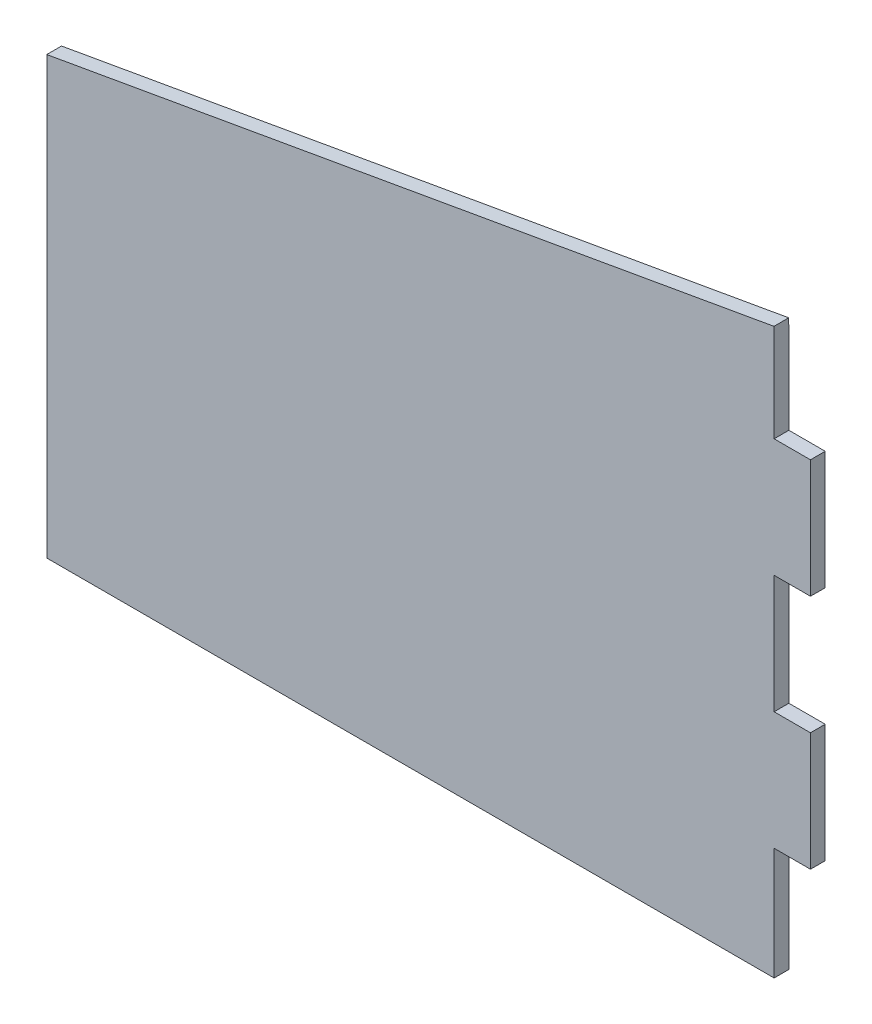
ISO-10303-21;
HEADER;
FILE_DESCRIPTION(('STEP AP214'),'2;1');
FILE_NAME('part.step','',(''),(''),'','','');
FILE_SCHEMA(('AUTOMOTIVE_DESIGN { 1 0 10303 214 1 1 1 1 }'));
ENDSEC;
DATA;
#1=APPLICATION_CONTEXT('core data for automotive mechanical design processes');
#2=APPLICATION_PROTOCOL_DEFINITION('international standard','automotive_design',2000,#1);
#3=PRODUCT_CONTEXT('',#1,'mechanical');
#4=PRODUCT('Part','Part','',(#3));
#5=PRODUCT_RELATED_PRODUCT_CATEGORY('part','',(#4));
#6=PRODUCT_DEFINITION_FORMATION('','',#4);
#7=PRODUCT_DEFINITION_CONTEXT('part definition',#1,'design');
#8=PRODUCT_DEFINITION('design','',#6,#7);
#9=PRODUCT_DEFINITION_SHAPE('','',#8);
#10=(LENGTH_UNIT() NAMED_UNIT(*) SI_UNIT(.MILLI.,.METRE.));
#11=(NAMED_UNIT(*) PLANE_ANGLE_UNIT() SI_UNIT($,.RADIAN.));
#12=(NAMED_UNIT(*) SI_UNIT($,.STERADIAN.) SOLID_ANGLE_UNIT());
#13=UNCERTAINTY_MEASURE_WITH_UNIT(LENGTH_MEASURE(1.E-05),#10,'distance_accuracy_value','');
#14=(GEOMETRIC_REPRESENTATION_CONTEXT(3) GLOBAL_UNCERTAINTY_ASSIGNED_CONTEXT((#13)) GLOBAL_UNIT_ASSIGNED_CONTEXT((#10,
#11,#12)) REPRESENTATION_CONTEXT('',''));
#15=CARTESIAN_POINT('',(0.,0.,0.));
#16=DIRECTION('',(0.,0.,1.));
#17=DIRECTION('',(1.,0.,0.));
#18=AXIS2_PLACEMENT_3D('',#15,#16,#17);
#19=CARTESIAN_POINT('',(0.,-91.4769385848753,196.208778379794));
#20=DIRECTION('',(0.999998823684038,0.00153382871905047,0.));
#21=DIRECTION('',(-0.00153382871905047,0.999998823684039,0.));
#22=AXIS2_PLACEMENT_3D('',#19,#20,#21);
#23=PLANE('',#22);
#24=DIRECTION('',(-0.00153382871905047,0.999998823684039,0.));
#25=VECTOR('',#24,1.);
#26=CARTESIAN_POINT('',(0.,-91.4769385848753,206.368778379794));
#27=LINE('',#26,#25);
#28=CARTESIAN_POINT('',(0.,-91.4769385848753,206.368778379794));
#29=VERTEX_POINT('',#28);
#30=CARTESIAN_POINT('',(-0.102720764161568,-24.5068512122227,206.368778379794));
#31=VERTEX_POINT('',#30);
#32=EDGE_CURVE('E160',#29,#31,#27,.T.);
#33=ORIENTED_EDGE('',*,*,#32,.F.);
#34=DIRECTION('',(0.,0.,1.));
#35=VECTOR('',#34,1.);
#36=CARTESIAN_POINT('',(0.,-91.4769385848753,196.208778379794));
#37=LINE('',#36,#35);
#38=CARTESIAN_POINT('',(0.,-91.4769385848753,196.208778379794));
#39=VERTEX_POINT('',#38);
#40=EDGE_CURVE('E11',#39,#29,#37,.T.);
#41=ORIENTED_EDGE('',*,*,#40,.F.);
#42=DIRECTION('',(-0.00153382871905047,0.999998823684039,0.));
#43=VECTOR('',#42,1.);
#44=CARTESIAN_POINT('',(0.,-91.4769385848753,196.208778379794));
#45=LINE('',#44,#43);
#46=CARTESIAN_POINT('',(-0.102720764161568,-24.5068512122227,196.208778379794));
#47=VERTEX_POINT('',#46);
#48=EDGE_CURVE('E192',#39,#47,#45,.T.);
#49=ORIENTED_EDGE('',*,*,#48,.T.);
#50=DIRECTION('',(0.,0.,1.));
#51=VECTOR('',#50,1.);
#52=CARTESIAN_POINT('',(-0.102720764161568,-24.5068512122227,196.208778379794));
#53=LINE('',#52,#51);
#54=EDGE_CURVE('E42',#47,#31,#53,.T.);
#55=ORIENTED_EDGE('',*,*,#54,.T.);
#56=EDGE_LOOP('',(#33,#41,#49,#55));
#57=FACE_BOUND('',#56,.T.);
#58=ADVANCED_FACE('F39',(#57),#23,.T.);
#59=CARTESIAN_POINT('',(0.,-91.4769385848753,196.208778379794));
#60=DIRECTION('',(0.,1.,0.));
#61=DIRECTION('',(0.,0.,1.));
#62=AXIS2_PLACEMENT_3D('',#59,#60,#61);
#63=PLANE('',#62);
#64=DIRECTION('',(-1.,0.,0.));
#65=VECTOR('',#64,1.);
#66=CARTESIAN_POINT('',(0.,-91.4769385848753,206.368778379794));
#67=LINE('',#66,#65);
#68=CARTESIAN_POINT('',(25.,-91.4769385848753,206.368778379794));
#69=VERTEX_POINT('',#68);
#70=EDGE_CURVE('E190',#69,#29,#67,.T.);
#71=ORIENTED_EDGE('',*,*,#70,.F.);
#72=DIRECTION('',(0.,0.,1.));
#73=VECTOR('',#72,1.);
#74=CARTESIAN_POINT('',(25.,-91.4769385848753,196.208778379794));
#75=LINE('',#74,#73);
#76=CARTESIAN_POINT('',(25.,-91.4769385848753,196.208778379794));
#77=VERTEX_POINT('',#76);
#78=EDGE_CURVE('E48',#77,#69,#75,.T.);
#79=ORIENTED_EDGE('',*,*,#78,.F.);
#80=DIRECTION('',(-1.,0.,0.));
#81=VECTOR('',#80,1.);
#82=CARTESIAN_POINT('',(0.,-91.4769385848753,196.208778379794));
#83=LINE('',#82,#81);
#84=EDGE_CURVE('E150',#77,#39,#83,.T.);
#85=ORIENTED_EDGE('',*,*,#84,.T.);
#86=ORIENTED_EDGE('',*,*,#40,.T.);
#87=EDGE_LOOP('',(#71,#79,#85,#86));
#88=FACE_BOUND('',#87,.T.);
#89=ADVANCED_FACE('F212',(#88),#63,.T.);
#90=CARTESIAN_POINT('',(25.,-172.79387716975,196.208778379794));
#91=DIRECTION('',(1.,0.,0.));
#92=DIRECTION('',(0.,0.,-1.));
#93=AXIS2_PLACEMENT_3D('',#90,#91,#92);
#94=PLANE('',#93);
#95=DIRECTION('',(0.,1.,0.));
#96=VECTOR('',#95,1.);
#97=CARTESIAN_POINT('',(25.,-172.79387716975,206.368778379794));
#98=LINE('',#97,#96);
#99=CARTESIAN_POINT('',(25.,-172.79387716975,206.368778379794));
#100=VERTEX_POINT('',#99);
#101=EDGE_CURVE('E137',#100,#69,#98,.T.);
#102=ORIENTED_EDGE('',*,*,#101,.F.);
#103=DIRECTION('',(0.,0.,1.));
#104=VECTOR('',#103,1.);
#105=CARTESIAN_POINT('',(25.,-172.79387716975,196.208778379794));
#106=LINE('',#105,#104);
#107=CARTESIAN_POINT('',(25.,-172.79387716975,196.208778379794));
#108=VERTEX_POINT('',#107);
#109=EDGE_CURVE('E132',#108,#100,#106,.T.);
#110=ORIENTED_EDGE('',*,*,#109,.F.);
#111=DIRECTION('',(0.,1.,0.));
#112=VECTOR('',#111,1.);
#113=CARTESIAN_POINT('',(25.,-172.79387716975,196.208778379794));
#114=LINE('',#113,#112);
#115=EDGE_CURVE('E135',#108,#77,#114,.T.);
#116=ORIENTED_EDGE('',*,*,#115,.T.);
#117=ORIENTED_EDGE('',*,*,#78,.T.);
#118=EDGE_LOOP('',(#102,#110,#116,#117));
#119=FACE_BOUND('',#118,.T.);
#120=ADVANCED_FACE('F134',(#119),#94,.T.);
#121=CARTESIAN_POINT('',(0.,-172.79387716975,196.208778379794));
#122=DIRECTION('',(0.,-1.,0.));
#123=DIRECTION('',(0.,0.,-1.));
#124=AXIS2_PLACEMENT_3D('',#121,#122,#123);
#125=PLANE('',#124);
#126=DIRECTION('',(1.,0.,0.));
#127=VECTOR('',#126,1.);
#128=CARTESIAN_POINT('',(0.,-172.79387716975,206.368778379794));
#129=LINE('',#128,#127);
#130=CARTESIAN_POINT('',(0.,-172.79387716975,206.368778379794));
#131=VERTEX_POINT('',#130);
#132=EDGE_CURVE('E187',#131,#100,#129,.T.);
#133=ORIENTED_EDGE('',*,*,#132,.F.);
#134=DIRECTION('',(0.,0.,1.));
#135=VECTOR('',#134,1.);
#136=CARTESIAN_POINT('',(0.,-172.79387716975,196.208778379794));
#137=LINE('',#136,#135);
#138=CARTESIAN_POINT('',(0.,-172.79387716975,196.208778379794));
#139=VERTEX_POINT('',#138);
#140=EDGE_CURVE('E142',#139,#131,#137,.T.);
#141=ORIENTED_EDGE('',*,*,#140,.F.);
#142=DIRECTION('',(1.,0.,0.));
#143=VECTOR('',#142,1.);
#144=CARTESIAN_POINT('',(0.,-172.79387716975,196.208778379794));
#145=LINE('',#144,#143);
#146=EDGE_CURVE('E148',#139,#108,#145,.T.);
#147=ORIENTED_EDGE('',*,*,#146,.T.);
#148=ORIENTED_EDGE('',*,*,#109,.T.);
#149=EDGE_LOOP('',(#133,#141,#147,#148));
#150=FACE_BOUND('',#149,.T.);
#151=ADVANCED_FACE('F152',(#150),#125,.T.);
#152=CARTESIAN_POINT('',(0.,-254.110815754626,196.208778379794));
#153=DIRECTION('',(1.,0.,0.));
#154=DIRECTION('',(0.,1.,0.));
#155=AXIS2_PLACEMENT_3D('',#152,#153,#154);
#156=PLANE('',#155);
#157=DIRECTION('',(0.,1.,0.));
#158=VECTOR('',#157,1.);
#159=CARTESIAN_POINT('',(0.,-254.110815754626,206.368778379794));
#160=LINE('',#159,#158);
#161=CARTESIAN_POINT('',(0.,-254.110815754626,206.368778379794));
#162=VERTEX_POINT('',#161);
#163=EDGE_CURVE('E184',#162,#131,#160,.T.);
#164=ORIENTED_EDGE('',*,*,#163,.F.);
#165=DIRECTION('',(0.,0.,1.));
#166=VECTOR('',#165,1.);
#167=CARTESIAN_POINT('',(0.,-254.110815754626,196.208778379794));
#168=LINE('',#167,#166);
#169=CARTESIAN_POINT('',(0.,-254.110815754626,196.208778379794));
#170=VERTEX_POINT('',#169);
#171=EDGE_CURVE('E196',#170,#162,#168,.T.);
#172=ORIENTED_EDGE('',*,*,#171,.F.);
#173=DIRECTION('',(0.,1.,0.));
#174=VECTOR('',#173,1.);
#175=CARTESIAN_POINT('',(0.,-254.110815754626,196.208778379794));
#176=LINE('',#175,#174);
#177=EDGE_CURVE('E153',#170,#139,#176,.T.);
#178=ORIENTED_EDGE('',*,*,#177,.T.);
#179=ORIENTED_EDGE('',*,*,#140,.T.);
#180=EDGE_LOOP('',(#164,#172,#178,#179));
#181=FACE_BOUND('',#180,.T.);
#182=ADVANCED_FACE('F225',(#181),#156,.T.);
#183=CARTESIAN_POINT('',(0.,-254.110815754626,196.208778379794));
#184=DIRECTION('',(0.,1.,0.));
#185=DIRECTION('',(0.,0.,1.));
#186=AXIS2_PLACEMENT_3D('',#183,#184,#185);
#187=PLANE('',#186);
#188=DIRECTION('',(-1.,0.,0.));
#189=VECTOR('',#188,1.);
#190=CARTESIAN_POINT('',(0.,-254.110815754626,206.368778379794));
#191=LINE('',#190,#189);
#192=CARTESIAN_POINT('',(25.,-254.110815754626,206.368778379794));
#193=VERTEX_POINT('',#192);
#194=EDGE_CURVE('E181',#193,#162,#191,.T.);
#195=ORIENTED_EDGE('',*,*,#194,.F.);
#196=DIRECTION('',(0.,0.,1.));
#197=VECTOR('',#196,1.);
#198=CARTESIAN_POINT('',(25.,-254.110815754626,196.208778379794));
#199=LINE('',#198,#197);
#200=CARTESIAN_POINT('',(25.,-254.110815754626,196.208778379794));
#201=VERTEX_POINT('',#200);
#202=EDGE_CURVE('E198',#201,#193,#199,.T.);
#203=ORIENTED_EDGE('',*,*,#202,.F.);
#204=DIRECTION('',(-1.,0.,0.));
#205=VECTOR('',#204,1.);
#206=CARTESIAN_POINT('',(0.,-254.110815754626,196.208778379794));
#207=LINE('',#206,#205);
#208=EDGE_CURVE('E155',#201,#170,#207,.T.);
#209=ORIENTED_EDGE('',*,*,#208,.T.);
#210=ORIENTED_EDGE('',*,*,#171,.T.);
#211=EDGE_LOOP('',(#195,#203,#209,#210));
#212=FACE_BOUND('',#211,.T.);
#213=ADVANCED_FACE('F228',(#212),#187,.T.);
#214=CARTESIAN_POINT('',(25.,-335.427754339501,196.208778379794));
#215=DIRECTION('',(1.,0.,0.));
#216=DIRECTION('',(0.,0.,-1.));
#217=AXIS2_PLACEMENT_3D('',#214,#215,#216);
#218=PLANE('',#217);
#219=DIRECTION('',(0.,1.,0.));
#220=VECTOR('',#219,1.);
#221=CARTESIAN_POINT('',(25.,-335.427754339501,206.368778379794));
#222=LINE('',#221,#220);
#223=CARTESIAN_POINT('',(25.,-335.427754339501,206.368778379794));
#224=VERTEX_POINT('',#223);
#225=EDGE_CURVE('E178',#224,#193,#222,.T.);
#226=ORIENTED_EDGE('',*,*,#225,.F.);
#227=DIRECTION('',(0.,0.,1.));
#228=VECTOR('',#227,1.);
#229=CARTESIAN_POINT('',(25.,-335.427754339501,196.208778379794));
#230=LINE('',#229,#228);
#231=CARTESIAN_POINT('',(25.,-335.427754339501,196.208778379794));
#232=VERTEX_POINT('',#231);
#233=EDGE_CURVE('E200',#232,#224,#230,.T.);
#234=ORIENTED_EDGE('',*,*,#233,.F.);
#235=DIRECTION('',(0.,1.,0.));
#236=VECTOR('',#235,1.);
#237=CARTESIAN_POINT('',(25.,-335.427754339501,196.208778379794));
#238=LINE('',#237,#236);
#239=EDGE_CURVE('E382',#232,#201,#238,.T.);
#240=ORIENTED_EDGE('',*,*,#239,.T.);
#241=ORIENTED_EDGE('',*,*,#202,.T.);
#242=EDGE_LOOP('',(#226,#234,#240,#241));
#243=FACE_BOUND('',#242,.T.);
#244=ADVANCED_FACE('F232',(#243),#218,.T.);
#245=CARTESIAN_POINT('',(0.,-335.427754339501,196.208778379794));
#246=DIRECTION('',(0.,-1.,0.));
#247=DIRECTION('',(0.,0.,-1.));
#248=AXIS2_PLACEMENT_3D('',#245,#246,#247);
#249=PLANE('',#248);
#250=DIRECTION('',(1.,0.,0.));
#251=VECTOR('',#250,1.);
#252=CARTESIAN_POINT('',(0.,-335.427754339501,206.368778379794));
#253=LINE('',#252,#251);
#254=CARTESIAN_POINT('',(0.,-335.427754339501,206.368778379794));
#255=VERTEX_POINT('',#254);
#256=EDGE_CURVE('E175',#255,#224,#253,.T.);
#257=ORIENTED_EDGE('',*,*,#256,.F.);
#258=DIRECTION('',(0.,0.,1.));
#259=VECTOR('',#258,1.);
#260=CARTESIAN_POINT('',(0.,-335.427754339501,196.208778379794));
#261=LINE('',#260,#259);
#262=CARTESIAN_POINT('',(0.,-335.427754339501,196.208778379794));
#263=VERTEX_POINT('',#262);
#264=EDGE_CURVE('E202',#263,#255,#261,.T.);
#265=ORIENTED_EDGE('',*,*,#264,.F.);
#266=DIRECTION('',(1.,0.,0.));
#267=VECTOR('',#266,1.);
#268=CARTESIAN_POINT('',(0.,-335.427754339501,196.208778379794));
#269=LINE('',#268,#267);
#270=EDGE_CURVE('E386',#263,#232,#269,.T.);
#271=ORIENTED_EDGE('',*,*,#270,.T.);
#272=ORIENTED_EDGE('',*,*,#233,.T.);
#273=EDGE_LOOP('',(#257,#265,#271,#272));
#274=FACE_BOUND('',#273,.T.);
#275=ADVANCED_FACE('F236',(#274),#249,.T.);
#276=CARTESIAN_POINT('',(0.,-412.720125467025,196.208778379794));
#277=DIRECTION('',(1.,0.,0.));
#278=DIRECTION('',(0.,1.,0.));
#279=AXIS2_PLACEMENT_3D('',#276,#277,#278);
#280=PLANE('',#279);
#281=DIRECTION('',(0.,1.,0.));
#282=VECTOR('',#281,1.);
#283=CARTESIAN_POINT('',(0.,-412.720125467025,206.368778379794));
#284=LINE('',#283,#282);
#285=CARTESIAN_POINT('',(0.,-412.720125467025,206.368778379794));
#286=VERTEX_POINT('',#285);
#287=EDGE_CURVE('E172',#286,#255,#284,.T.);
#288=ORIENTED_EDGE('',*,*,#287,.F.);
#289=DIRECTION('',(0.,0.,1.));
#290=VECTOR('',#289,1.);
#291=CARTESIAN_POINT('',(0.,-412.720125467025,196.208778379794));
#292=LINE('',#291,#290);
#293=CARTESIAN_POINT('',(0.,-412.720125467025,196.208778379794));
#294=VERTEX_POINT('',#293);
#295=EDGE_CURVE('E204',#294,#286,#292,.T.);
#296=ORIENTED_EDGE('',*,*,#295,.F.);
#297=DIRECTION('',(0.,1.,0.));
#298=VECTOR('',#297,1.);
#299=CARTESIAN_POINT('',(0.,-412.720125467025,196.208778379794));
#300=LINE('',#299,#298);
#301=EDGE_CURVE('E375',#294,#263,#300,.T.);
#302=ORIENTED_EDGE('',*,*,#301,.T.);
#303=ORIENTED_EDGE('',*,*,#264,.T.);
#304=EDGE_LOOP('',(#288,#296,#302,#303));
#305=FACE_BOUND('',#304,.T.);
#306=ADVANCED_FACE('F240',(#305),#280,.T.);
#307=CARTESIAN_POINT('',(-500.385059294363,-412.720125467025,196.208778379794));
#308=DIRECTION('',(0.,-1.,0.));
#309=DIRECTION('',(0.,0.,-1.));
#310=AXIS2_PLACEMENT_3D('',#307,#308,#309);
#311=PLANE('',#310);
#312=DIRECTION('',(1.,0.,0.));
#313=VECTOR('',#312,1.);
#314=CARTESIAN_POINT('',(-500.385059294363,-412.720125467025,206.368778379794));
#315=LINE('',#314,#313);
#316=CARTESIAN_POINT('',(-500.385059294363,-412.720125467025,206.368778379794));
#317=VERTEX_POINT('',#316);
#318=EDGE_CURVE('E169',#317,#286,#315,.T.);
#319=ORIENTED_EDGE('',*,*,#318,.F.);
#320=DIRECTION('',(0.,0.,1.));
#321=VECTOR('',#320,1.);
#322=CARTESIAN_POINT('',(-500.385059294363,-412.720125467025,196.208778379794));
#323=LINE('',#322,#321);
#324=CARTESIAN_POINT('',(-500.385059294363,-412.720125467025,196.208778379794));
#325=VERTEX_POINT('',#324);
#326=EDGE_CURVE('E206',#325,#317,#323,.T.);
#327=ORIENTED_EDGE('',*,*,#326,.F.);
#328=DIRECTION('',(1.,0.,0.));
#329=VECTOR('',#328,1.);
#330=CARTESIAN_POINT('',(-500.385059294363,-412.720125467025,196.208778379794));
#331=LINE('',#330,#329);
#332=EDGE_CURVE('E371',#325,#294,#331,.T.);
#333=ORIENTED_EDGE('',*,*,#332,.T.);
#334=ORIENTED_EDGE('',*,*,#295,.T.);
#335=EDGE_LOOP('',(#319,#327,#333,#334));
#336=FACE_BOUND('',#335,.T.);
#337=ADVANCED_FACE('F244',(#336),#311,.T.);
#338=CARTESIAN_POINT('',(-500.385059294363,-112.720125467025,196.208778379794));
#339=DIRECTION('',(-1.,0.,0.));
#340=DIRECTION('',(0.,-1.,0.));
#341=AXIS2_PLACEMENT_3D('',#338,#339,#340);
#342=PLANE('',#341);
#343=DIRECTION('',(0.,-1.,0.));
#344=VECTOR('',#343,1.);
#345=CARTESIAN_POINT('',(-500.385059294363,-112.720125467025,206.368778379794));
#346=LINE('',#345,#344);
#347=CARTESIAN_POINT('',(-500.385059294363,-112.720125467025,206.368778379794));
#348=VERTEX_POINT('',#347);
#349=EDGE_CURVE('E166',#348,#317,#346,.T.);
#350=ORIENTED_EDGE('',*,*,#349,.F.);
#351=DIRECTION('',(0.,0.,1.));
#352=VECTOR('',#351,1.);
#353=CARTESIAN_POINT('',(-500.385059294363,-112.720125467025,196.208778379794));
#354=LINE('',#353,#352);
#355=CARTESIAN_POINT('',(-500.385059294363,-112.720125467025,196.208778379794));
#356=VERTEX_POINT('',#355);
#357=EDGE_CURVE('E207',#356,#348,#354,.T.);
#358=ORIENTED_EDGE('',*,*,#357,.F.);
#359=DIRECTION('',(0.,-1.,0.));
#360=VECTOR('',#359,1.);
#361=CARTESIAN_POINT('',(-500.385059294363,-112.720125467025,196.208778379794));
#362=LINE('',#361,#360);
#363=EDGE_CURVE('E392',#356,#325,#362,.T.);
#364=ORIENTED_EDGE('',*,*,#363,.T.);
#365=ORIENTED_EDGE('',*,*,#326,.T.);
#366=EDGE_LOOP('',(#350,#358,#364,#365));
#367=FACE_BOUND('',#366,.T.);
#368=ADVANCED_FACE('F248',(#367),#342,.T.);
#369=CARTESIAN_POINT('',(-0.102720764161568,-24.5068512122227,196.208778379794));
#370=DIRECTION('',(-0.173648177666934,0.984807753012207,0.));
#371=DIRECTION('',(-0.984807753012207,-0.173648177666934,0.));
#372=AXIS2_PLACEMENT_3D('',#369,#370,#371);
#373=PLANE('',#372);
#374=DIRECTION('',(-0.984807753012207,-0.173648177666934,0.));
#375=VECTOR('',#374,1.);
#376=CARTESIAN_POINT('',(-0.102720764161568,-24.5068512122227,206.368778379794));
#377=LINE('',#376,#375);
#378=EDGE_CURVE('E163',#31,#348,#377,.T.);
#379=ORIENTED_EDGE('',*,*,#378,.F.);
#380=ORIENTED_EDGE('',*,*,#54,.F.);
#381=DIRECTION('',(-0.984807753012207,-0.173648177666934,0.));
#382=VECTOR('',#381,1.);
#383=CARTESIAN_POINT('',(-0.102720764161568,-24.5068512122227,196.208778379794));
#384=LINE('',#383,#382);
#385=EDGE_CURVE('E394',#47,#356,#384,.T.);
#386=ORIENTED_EDGE('',*,*,#385,.T.);
#387=ORIENTED_EDGE('',*,*,#357,.T.);
#388=EDGE_LOOP('',(#379,#380,#386,#387));
#389=FACE_BOUND('',#388,.T.);
#390=ADVANCED_FACE('F209',(#389),#373,.T.);
#391=CARTESIAN_POINT('',(0.,0.,196.208778379794));
#392=DIRECTION('',(0.,0.,-1.));
#393=DIRECTION('',(-1.,0.,0.));
#394=AXIS2_PLACEMENT_3D('',#391,#392,#393);
#395=PLANE('',#394);
#396=ORIENTED_EDGE('',*,*,#48,.F.);
#397=ORIENTED_EDGE('',*,*,#84,.F.);
#398=ORIENTED_EDGE('',*,*,#115,.F.);
#399=ORIENTED_EDGE('',*,*,#146,.F.);
#400=ORIENTED_EDGE('',*,*,#177,.F.);
#401=ORIENTED_EDGE('',*,*,#208,.F.);
#402=ORIENTED_EDGE('',*,*,#239,.F.);
#403=ORIENTED_EDGE('',*,*,#270,.F.);
#404=ORIENTED_EDGE('',*,*,#301,.F.);
#405=ORIENTED_EDGE('',*,*,#332,.F.);
#406=ORIENTED_EDGE('',*,*,#363,.F.);
#407=ORIENTED_EDGE('',*,*,#385,.F.);
#408=EDGE_LOOP('',(#396,#397,#398,#399,#400,#401,#402,#403,#404,#405,#406,#407));
#409=FACE_BOUND('',#408,.T.);
#410=ADVANCED_FACE('F146',(#409),#395,.T.);
#411=CARTESIAN_POINT('',(0.,0.,206.368778379794));
#412=DIRECTION('',(0.,0.,-1.));
#413=DIRECTION('',(-1.,0.,0.));
#414=AXIS2_PLACEMENT_3D('',#411,#412,#413);
#415=PLANE('',#414);
#416=ORIENTED_EDGE('',*,*,#32,.T.);
#417=ORIENTED_EDGE('',*,*,#378,.T.);
#418=ORIENTED_EDGE('',*,*,#349,.T.);
#419=ORIENTED_EDGE('',*,*,#318,.T.);
#420=ORIENTED_EDGE('',*,*,#287,.T.);
#421=ORIENTED_EDGE('',*,*,#256,.T.);
#422=ORIENTED_EDGE('',*,*,#225,.T.);
#423=ORIENTED_EDGE('',*,*,#194,.T.);
#424=ORIENTED_EDGE('',*,*,#163,.T.);
#425=ORIENTED_EDGE('',*,*,#132,.T.);
#426=ORIENTED_EDGE('',*,*,#101,.T.);
#427=ORIENTED_EDGE('',*,*,#70,.T.);
#428=EDGE_LOOP('',(#416,#417,#418,#419,#420,#421,#422,#423,#424,#425,#426,#427));
#429=FACE_BOUND('',#428,.T.);
#430=ADVANCED_FACE('F211',(#429),#415,.F.);
#431=CLOSED_SHELL('',(#58,#89,#120,#151,#182,#213,#244,#275,#306,#337,#368,#390,#410,#430));
#432=MANIFOLD_SOLID_BREP('B2',#431);
#433=ADVANCED_BREP_SHAPE_REPRESENTATION('',(#18,#432),#14);
#434=SHAPE_DEFINITION_REPRESENTATION(#9,#433);
ENDSEC;
END-ISO-10303-21;
